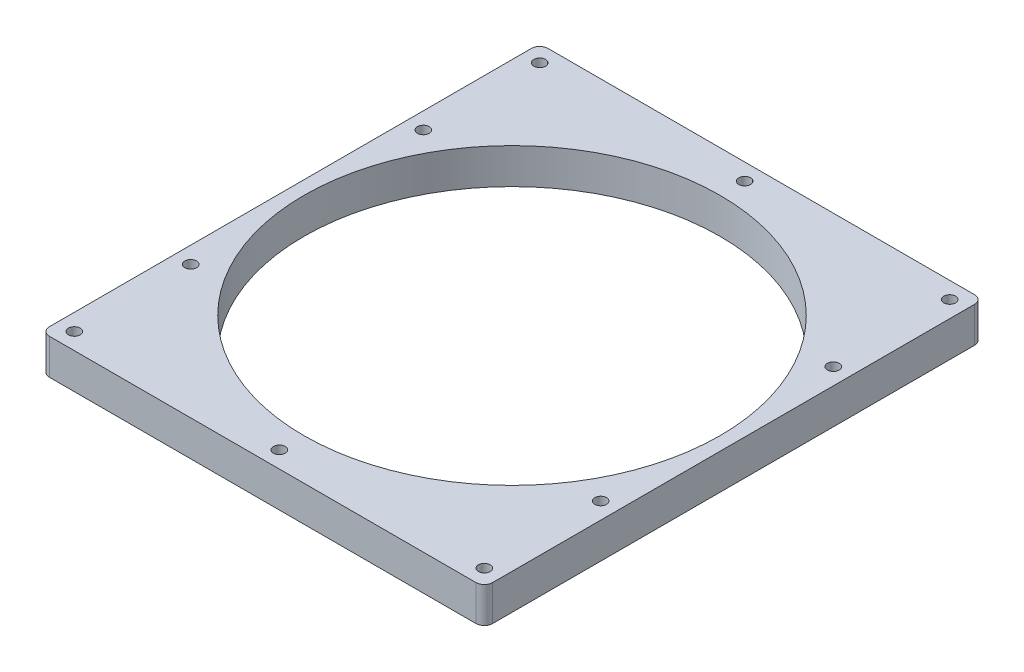
ISO-10303-21;
HEADER;
FILE_DESCRIPTION(('STEP AP214'),'2;1');
FILE_NAME('part.step','',(''),(''),'','','');
FILE_SCHEMA(('AUTOMOTIVE_DESIGN { 1 0 10303 214 1 1 1 1 }'));
ENDSEC;
DATA;
#1=APPLICATION_CONTEXT('core data for automotive mechanical design processes');
#2=APPLICATION_PROTOCOL_DEFINITION('international standard','automotive_design',2000,#1);
#3=PRODUCT_CONTEXT('',#1,'mechanical');
#4=PRODUCT('Part','Part','',(#3));
#5=PRODUCT_RELATED_PRODUCT_CATEGORY('part','',(#4));
#6=PRODUCT_DEFINITION_FORMATION('','',#4);
#7=PRODUCT_DEFINITION_CONTEXT('part definition',#1,'design');
#8=PRODUCT_DEFINITION('design','',#6,#7);
#9=PRODUCT_DEFINITION_SHAPE('','',#8);
#10=(LENGTH_UNIT() NAMED_UNIT(*) SI_UNIT(.MILLI.,.METRE.));
#11=(NAMED_UNIT(*) PLANE_ANGLE_UNIT() SI_UNIT($,.RADIAN.));
#12=(NAMED_UNIT(*) SI_UNIT($,.STERADIAN.) SOLID_ANGLE_UNIT());
#13=UNCERTAINTY_MEASURE_WITH_UNIT(LENGTH_MEASURE(1.E-05),#10,'distance_accuracy_value','');
#14=(GEOMETRIC_REPRESENTATION_CONTEXT(3) GLOBAL_UNCERTAINTY_ASSIGNED_CONTEXT((#13)) GLOBAL_UNIT_ASSIGNED_CONTEXT((#10,
#11,#12)) REPRESENTATION_CONTEXT('',''));
#15=CARTESIAN_POINT('',(0.,0.,0.));
#16=DIRECTION('',(0.,0.,1.));
#17=DIRECTION('',(1.,0.,0.));
#18=AXIS2_PLACEMENT_3D('',#15,#16,#17);
#19=CARTESIAN_POINT('',(0.,12.825,0.));
#20=DIRECTION('',(0.,-1.,0.));
#21=DIRECTION('',(0.,0.,-1.));
#22=AXIS2_PLACEMENT_3D('',#19,#20,#21);
#23=PLANE('',#22);
#24=DIRECTION('',(-1.,0.,0.));
#25=VECTOR('',#24,1.);
#26=CARTESIAN_POINT('',(-80.,12.825,-90.));
#27=LINE('',#26,#25);
#28=CARTESIAN_POINT('',(77.,12.825,-90.));
#29=VERTEX_POINT('',#28);
#30=CARTESIAN_POINT('',(-77.,12.825,-90.));
#31=VERTEX_POINT('',#30);
#32=EDGE_CURVE('E201',#29,#31,#27,.T.);
#33=ORIENTED_EDGE('',*,*,#32,.T.);
#34=CARTESIAN_POINT('',(-77.,12.825,-87.));
#35=DIRECTION('',(0.,-1.,0.));
#36=DIRECTION('',(0.,0.,-1.));
#37=AXIS2_PLACEMENT_3D('',#34,#35,#36);
#38=CIRCLE('',#37,3.);
#39=CARTESIAN_POINT('',(-80.,12.825,-86.9999999999999));
#40=VERTEX_POINT('',#39);
#41=EDGE_CURVE('E174',#31,#40,#38,.F.);
#42=ORIENTED_EDGE('',*,*,#41,.T.);
#43=DIRECTION('',(0.,0.,1.));
#44=VECTOR('',#43,1.);
#45=CARTESIAN_POINT('',(-80.,12.825,90.));
#46=LINE('',#45,#44);
#47=CARTESIAN_POINT('',(-80.,12.825,87.));
#48=VERTEX_POINT('',#47);
#49=EDGE_CURVE('E131',#40,#48,#46,.T.);
#50=ORIENTED_EDGE('',*,*,#49,.T.);
#51=CARTESIAN_POINT('',(-77.,12.825,87.));
#52=DIRECTION('',(0.,-1.,0.));
#53=DIRECTION('',(0.,0.,-1.));
#54=AXIS2_PLACEMENT_3D('',#51,#52,#53);
#55=CIRCLE('',#54,3.);
#56=CARTESIAN_POINT('',(-77.,12.825,90.));
#57=VERTEX_POINT('',#56);
#58=EDGE_CURVE('E66',#48,#57,#55,.F.);
#59=ORIENTED_EDGE('',*,*,#58,.T.);
#60=DIRECTION('',(1.,0.,0.));
#61=VECTOR('',#60,1.);
#62=CARTESIAN_POINT('',(-80.,12.825,90.));
#63=LINE('',#62,#61);
#64=CARTESIAN_POINT('',(77.,12.825,90.));
#65=VERTEX_POINT('',#64);
#66=EDGE_CURVE('E152',#57,#65,#63,.T.);
#67=ORIENTED_EDGE('',*,*,#66,.T.);
#68=CARTESIAN_POINT('',(77.,12.825,87.));
#69=DIRECTION('',(0.,-1.,0.));
#70=DIRECTION('',(0.,0.,-1.));
#71=AXIS2_PLACEMENT_3D('',#68,#69,#70);
#72=CIRCLE('',#71,3.);
#73=CARTESIAN_POINT('',(80.,12.825,87.));
#74=VERTEX_POINT('',#73);
#75=EDGE_CURVE('E171',#65,#74,#72,.F.);
#76=ORIENTED_EDGE('',*,*,#75,.T.);
#77=DIRECTION('',(0.,0.,-1.));
#78=VECTOR('',#77,1.);
#79=CARTESIAN_POINT('',(80.,12.825,90.));
#80=LINE('',#79,#78);
#81=CARTESIAN_POINT('',(80.,12.825,-86.9999999999999));
#82=VERTEX_POINT('',#81);
#83=EDGE_CURVE('E145',#74,#82,#80,.T.);
#84=ORIENTED_EDGE('',*,*,#83,.T.);
#85=CARTESIAN_POINT('',(77.,12.825,-87.));
#86=DIRECTION('',(0.,-1.,0.));
#87=DIRECTION('',(0.,0.,-1.));
#88=AXIS2_PLACEMENT_3D('',#85,#86,#87);
#89=CIRCLE('',#88,3.);
#90=EDGE_CURVE('E168',#82,#29,#89,.F.);
#91=ORIENTED_EDGE('',*,*,#90,.T.);
#92=EDGE_LOOP('',(#33,#42,#50,#59,#67,#76,#84,#91));
#93=FACE_BOUND('',#92,.T.);
#94=CARTESIAN_POINT('',(0.,12.825,0.));
#95=DIRECTION('',(0.,1.,0.));
#96=DIRECTION('',(0.,0.,1.));
#97=AXIS2_PLACEMENT_3D('',#94,#95,#96);
#98=CIRCLE('',#97,75.125);
#99=CARTESIAN_POINT('',(0.,12.825,75.125));
#100=VERTEX_POINT('',#99);
#101=EDGE_CURVE('E214',#100,#100,#98,.T.);
#102=ORIENTED_EDGE('',*,*,#101,.F.);
#103=EDGE_LOOP('',(#102));
#104=FACE_BOUND('',#103,.T.);
#105=CARTESIAN_POINT('',(74.,12.825,-42.));
#106=DIRECTION('',(0.,1.,0.));
#107=DIRECTION('',(0.,0.,1.));
#108=AXIS2_PLACEMENT_3D('',#105,#106,#107);
#109=CIRCLE('',#108,2.125);
#110=CARTESIAN_POINT('',(74.,12.825,-39.875));
#111=VERTEX_POINT('',#110);
#112=EDGE_CURVE('E221',#111,#111,#109,.T.);
#113=ORIENTED_EDGE('',*,*,#112,.F.);
#114=EDGE_LOOP('',(#113));
#115=FACE_BOUND('',#114,.T.);
#116=CARTESIAN_POINT('',(-74.,12.825,84.));
#117=DIRECTION('',(0.,1.,0.));
#118=DIRECTION('',(0.,0.,1.));
#119=AXIS2_PLACEMENT_3D('',#116,#117,#118);
#120=CIRCLE('',#119,2.125);
#121=CARTESIAN_POINT('',(-74.,12.825,86.125));
#122=VERTEX_POINT('',#121);
#123=EDGE_CURVE('E227',#122,#122,#120,.T.);
#124=ORIENTED_EDGE('',*,*,#123,.F.);
#125=EDGE_LOOP('',(#124));
#126=FACE_BOUND('',#125,.T.);
#127=CARTESIAN_POINT('',(-74.,12.825,-42.));
#128=DIRECTION('',(0.,1.,0.));
#129=DIRECTION('',(0.,0.,-1.));
#130=AXIS2_PLACEMENT_3D('',#127,#128,#129);
#131=CIRCLE('',#130,2.125);
#132=CARTESIAN_POINT('',(-74.,12.825,-44.125));
#133=VERTEX_POINT('',#132);
#134=EDGE_CURVE('E235',#133,#133,#131,.T.);
#135=ORIENTED_EDGE('',*,*,#134,.F.);
#136=EDGE_LOOP('',(#135));
#137=FACE_BOUND('',#136,.T.);
#138=CARTESIAN_POINT('',(-74.,12.825,42.));
#139=DIRECTION('',(0.,1.,0.));
#140=DIRECTION('',(0.,0.,1.));
#141=AXIS2_PLACEMENT_3D('',#138,#139,#140);
#142=CIRCLE('',#141,2.125);
#143=CARTESIAN_POINT('',(-74.,12.825,44.125));
#144=VERTEX_POINT('',#143);
#145=EDGE_CURVE('E243',#144,#144,#142,.T.);
#146=ORIENTED_EDGE('',*,*,#145,.F.);
#147=EDGE_LOOP('',(#146));
#148=FACE_BOUND('',#147,.T.);
#149=CARTESIAN_POINT('',(-74.,12.825,-84.));
#150=DIRECTION('',(0.,1.,0.));
#151=DIRECTION('',(0.,0.,-1.));
#152=AXIS2_PLACEMENT_3D('',#149,#150,#151);
#153=CIRCLE('',#152,2.125);
#154=CARTESIAN_POINT('',(-74.,12.825,-86.125));
#155=VERTEX_POINT('',#154);
#156=EDGE_CURVE('E251',#155,#155,#153,.T.);
#157=ORIENTED_EDGE('',*,*,#156,.F.);
#158=EDGE_LOOP('',(#157));
#159=FACE_BOUND('',#158,.T.);
#160=CARTESIAN_POINT('',(74.,12.825,84.));
#161=DIRECTION('',(0.,1.,0.));
#162=DIRECTION('',(0.,0.,-1.));
#163=AXIS2_PLACEMENT_3D('',#160,#161,#162);
#164=CIRCLE('',#163,2.125);
#165=CARTESIAN_POINT('',(74.,12.825,81.875));
#166=VERTEX_POINT('',#165);
#167=EDGE_CURVE('E259',#166,#166,#164,.T.);
#168=ORIENTED_EDGE('',*,*,#167,.F.);
#169=EDGE_LOOP('',(#168));
#170=FACE_BOUND('',#169,.T.);
#171=CARTESIAN_POINT('',(74.,12.825,42.));
#172=DIRECTION('',(0.,1.,0.));
#173=DIRECTION('',(0.,0.,-1.));
#174=AXIS2_PLACEMENT_3D('',#171,#172,#173);
#175=CIRCLE('',#174,2.125);
#176=CARTESIAN_POINT('',(74.,12.825,39.875));
#177=VERTEX_POINT('',#176);
#178=EDGE_CURVE('E267',#177,#177,#175,.T.);
#179=ORIENTED_EDGE('',*,*,#178,.F.);
#180=EDGE_LOOP('',(#179));
#181=FACE_BOUND('',#180,.T.);
#182=CARTESIAN_POINT('',(74.,12.825,-84.));
#183=DIRECTION('',(0.,1.,0.));
#184=DIRECTION('',(0.,0.,1.));
#185=AXIS2_PLACEMENT_3D('',#182,#183,#184);
#186=CIRCLE('',#185,2.125);
#187=CARTESIAN_POINT('',(74.,12.825,-81.875));
#188=VERTEX_POINT('',#187);
#189=EDGE_CURVE('E275',#188,#188,#186,.T.);
#190=ORIENTED_EDGE('',*,*,#189,.F.);
#191=EDGE_LOOP('',(#190));
#192=FACE_BOUND('',#191,.T.);
#193=CARTESIAN_POINT('',(0.,12.825,84.));
#194=DIRECTION('',(0.,1.,0.));
#195=DIRECTION('',(0.,0.,1.));
#196=AXIS2_PLACEMENT_3D('',#193,#194,#195);
#197=CIRCLE('',#196,2.125);
#198=CARTESIAN_POINT('',(0.,12.825,86.125));
#199=VERTEX_POINT('',#198);
#200=EDGE_CURVE('E283',#199,#199,#197,.T.);
#201=ORIENTED_EDGE('',*,*,#200,.F.);
#202=EDGE_LOOP('',(#201));
#203=FACE_BOUND('',#202,.T.);
#204=CARTESIAN_POINT('',(0.,12.825,-84.));
#205=DIRECTION('',(0.,1.,0.));
#206=DIRECTION('',(0.,0.,-1.));
#207=AXIS2_PLACEMENT_3D('',#204,#205,#206);
#208=CIRCLE('',#207,2.125);
#209=CARTESIAN_POINT('',(0.,12.825,-86.125));
#210=VERTEX_POINT('',#209);
#211=EDGE_CURVE('E291',#210,#210,#208,.T.);
#212=ORIENTED_EDGE('',*,*,#211,.F.);
#213=EDGE_LOOP('',(#212));
#214=FACE_BOUND('',#213,.T.);
#215=ADVANCED_FACE('F45',(#93,#104,#115,#126,#137,#148,#159,#170,#181,#192,#203,#214),#23,.F.);
#216=CARTESIAN_POINT('',(0.,0.,0.));
#217=DIRECTION('',(0.,-1.,0.));
#218=DIRECTION('',(0.,0.,-1.));
#219=AXIS2_PLACEMENT_3D('',#216,#217,#218);
#220=PLANE('',#219);
#221=CARTESIAN_POINT('',(0.,0.,84.));
#222=DIRECTION('',(0.,1.,0.));
#223=DIRECTION('',(0.,0.,1.));
#224=AXIS2_PLACEMENT_3D('',#221,#222,#223);
#225=CIRCLE('',#224,2.125);
#226=CARTESIAN_POINT('',(0.,0.,86.125));
#227=VERTEX_POINT('',#226);
#228=EDGE_CURVE('E287',#227,#227,#225,.T.);
#229=ORIENTED_EDGE('',*,*,#228,.T.);
#230=EDGE_LOOP('',(#229));
#231=FACE_BOUND('',#230,.T.);
#232=CARTESIAN_POINT('',(74.,0.,42.));
#233=DIRECTION('',(0.,1.,0.));
#234=DIRECTION('',(0.,0.,-1.));
#235=AXIS2_PLACEMENT_3D('',#232,#233,#234);
#236=CIRCLE('',#235,2.125);
#237=CARTESIAN_POINT('',(74.,0.,39.875));
#238=VERTEX_POINT('',#237);
#239=EDGE_CURVE('E271',#238,#238,#236,.T.);
#240=ORIENTED_EDGE('',*,*,#239,.T.);
#241=EDGE_LOOP('',(#240));
#242=FACE_BOUND('',#241,.T.);
#243=CARTESIAN_POINT('',(-74.,0.,-84.));
#244=DIRECTION('',(0.,1.,0.));
#245=DIRECTION('',(0.,0.,-1.));
#246=AXIS2_PLACEMENT_3D('',#243,#244,#245);
#247=CIRCLE('',#246,2.125);
#248=CARTESIAN_POINT('',(-74.,0.,-86.125));
#249=VERTEX_POINT('',#248);
#250=EDGE_CURVE('E255',#249,#249,#247,.T.);
#251=ORIENTED_EDGE('',*,*,#250,.T.);
#252=EDGE_LOOP('',(#251));
#253=FACE_BOUND('',#252,.T.);
#254=CARTESIAN_POINT('',(-74.,0.,-42.));
#255=DIRECTION('',(0.,1.,0.));
#256=DIRECTION('',(0.,0.,-1.));
#257=AXIS2_PLACEMENT_3D('',#254,#255,#256);
#258=CIRCLE('',#257,2.125);
#259=CARTESIAN_POINT('',(-74.,0.,-44.125));
#260=VERTEX_POINT('',#259);
#261=EDGE_CURVE('E239',#260,#260,#258,.T.);
#262=ORIENTED_EDGE('',*,*,#261,.T.);
#263=EDGE_LOOP('',(#262));
#264=FACE_BOUND('',#263,.T.);
#265=CARTESIAN_POINT('',(74.,0.,-42.));
#266=DIRECTION('',(0.,1.,0.));
#267=DIRECTION('',(0.,0.,1.));
#268=AXIS2_PLACEMENT_3D('',#265,#266,#267);
#269=CIRCLE('',#268,2.125);
#270=CARTESIAN_POINT('',(74.,0.,-39.875));
#271=VERTEX_POINT('',#270);
#272=EDGE_CURVE('E223',#271,#271,#269,.T.);
#273=ORIENTED_EDGE('',*,*,#272,.T.);
#274=EDGE_LOOP('',(#273));
#275=FACE_BOUND('',#274,.T.);
#276=DIRECTION('',(0.,0.,1.));
#277=VECTOR('',#276,1.);
#278=CARTESIAN_POINT('',(-80.,0.,90.));
#279=LINE('',#278,#277);
#280=CARTESIAN_POINT('',(-80.,0.,-86.9999999999999));
#281=VERTEX_POINT('',#280);
#282=CARTESIAN_POINT('',(-80.,0.,87.));
#283=VERTEX_POINT('',#282);
#284=EDGE_CURVE('E129',#281,#283,#279,.T.);
#285=ORIENTED_EDGE('',*,*,#284,.F.);
#286=CARTESIAN_POINT('',(-77.,0.,-87.));
#287=DIRECTION('',(0.,-1.,0.));
#288=DIRECTION('',(0.,0.,-1.));
#289=AXIS2_PLACEMENT_3D('',#286,#287,#288);
#290=CIRCLE('',#289,3.);
#291=CARTESIAN_POINT('',(-77.,0.,-90.));
#292=VERTEX_POINT('',#291);
#293=EDGE_CURVE('E111',#281,#292,#290,.T.);
#294=ORIENTED_EDGE('',*,*,#293,.T.);
#295=DIRECTION('',(-1.,0.,0.));
#296=VECTOR('',#295,1.);
#297=CARTESIAN_POINT('',(-80.,0.,-90.));
#298=LINE('',#297,#296);
#299=CARTESIAN_POINT('',(77.,0.,-90.));
#300=VERTEX_POINT('',#299);
#301=EDGE_CURVE('E141',#300,#292,#298,.T.);
#302=ORIENTED_EDGE('',*,*,#301,.F.);
#303=CARTESIAN_POINT('',(77.,0.,-87.));
#304=DIRECTION('',(0.,-1.,0.));
#305=DIRECTION('',(0.,0.,-1.));
#306=AXIS2_PLACEMENT_3D('',#303,#304,#305);
#307=CIRCLE('',#306,3.);
#308=CARTESIAN_POINT('',(80.,0.,-86.9999999999999));
#309=VERTEX_POINT('',#308);
#310=EDGE_CURVE('E156',#300,#309,#307,.T.);
#311=ORIENTED_EDGE('',*,*,#310,.T.);
#312=DIRECTION('',(0.,0.,-1.));
#313=VECTOR('',#312,1.);
#314=CARTESIAN_POINT('',(80.,0.,90.));
#315=LINE('',#314,#313);
#316=CARTESIAN_POINT('',(80.,0.,87.));
#317=VERTEX_POINT('',#316);
#318=EDGE_CURVE('E147',#317,#309,#315,.T.);
#319=ORIENTED_EDGE('',*,*,#318,.F.);
#320=CARTESIAN_POINT('',(77.,0.,87.));
#321=DIRECTION('',(0.,-1.,0.));
#322=DIRECTION('',(0.,0.,-1.));
#323=AXIS2_PLACEMENT_3D('',#320,#321,#322);
#324=CIRCLE('',#323,3.);
#325=CARTESIAN_POINT('',(77.,0.,90.));
#326=VERTEX_POINT('',#325);
#327=EDGE_CURVE('E123',#317,#326,#324,.T.);
#328=ORIENTED_EDGE('',*,*,#327,.T.);
#329=DIRECTION('',(1.,0.,0.));
#330=VECTOR('',#329,1.);
#331=CARTESIAN_POINT('',(-80.,0.,90.));
#332=LINE('',#331,#330);
#333=CARTESIAN_POINT('',(-77.,0.,90.));
#334=VERTEX_POINT('',#333);
#335=EDGE_CURVE('E140',#334,#326,#332,.T.);
#336=ORIENTED_EDGE('',*,*,#335,.F.);
#337=CARTESIAN_POINT('',(-77.,0.,87.));
#338=DIRECTION('',(0.,-1.,0.));
#339=DIRECTION('',(0.,0.,-1.));
#340=AXIS2_PLACEMENT_3D('',#337,#338,#339);
#341=CIRCLE('',#340,3.);
#342=EDGE_CURVE('E133',#334,#283,#341,.T.);
#343=ORIENTED_EDGE('',*,*,#342,.T.);
#344=EDGE_LOOP('',(#285,#294,#302,#311,#319,#328,#336,#343));
#345=FACE_BOUND('',#344,.T.);
#346=CARTESIAN_POINT('',(0.,0.,0.));
#347=DIRECTION('',(0.,1.,0.));
#348=DIRECTION('',(0.,0.,1.));
#349=AXIS2_PLACEMENT_3D('',#346,#347,#348);
#350=CIRCLE('',#349,75.125);
#351=CARTESIAN_POINT('',(0.,0.,75.125));
#352=VERTEX_POINT('',#351);
#353=EDGE_CURVE('E207',#352,#352,#350,.T.);
#354=ORIENTED_EDGE('',*,*,#353,.T.);
#355=EDGE_LOOP('',(#354));
#356=FACE_BOUND('',#355,.T.);
#357=CARTESIAN_POINT('',(-74.,0.,84.));
#358=DIRECTION('',(0.,1.,0.));
#359=DIRECTION('',(0.,0.,1.));
#360=AXIS2_PLACEMENT_3D('',#357,#358,#359);
#361=CIRCLE('',#360,2.125);
#362=CARTESIAN_POINT('',(-74.,0.,86.125));
#363=VERTEX_POINT('',#362);
#364=EDGE_CURVE('E231',#363,#363,#361,.T.);
#365=ORIENTED_EDGE('',*,*,#364,.T.);
#366=EDGE_LOOP('',(#365));
#367=FACE_BOUND('',#366,.T.);
#368=CARTESIAN_POINT('',(-74.,0.,42.));
#369=DIRECTION('',(0.,1.,0.));
#370=DIRECTION('',(0.,0.,1.));
#371=AXIS2_PLACEMENT_3D('',#368,#369,#370);
#372=CIRCLE('',#371,2.125);
#373=CARTESIAN_POINT('',(-74.,0.,44.125));
#374=VERTEX_POINT('',#373);
#375=EDGE_CURVE('E247',#374,#374,#372,.T.);
#376=ORIENTED_EDGE('',*,*,#375,.T.);
#377=EDGE_LOOP('',(#376));
#378=FACE_BOUND('',#377,.T.);
#379=CARTESIAN_POINT('',(74.,0.,84.));
#380=DIRECTION('',(0.,1.,0.));
#381=DIRECTION('',(0.,0.,-1.));
#382=AXIS2_PLACEMENT_3D('',#379,#380,#381);
#383=CIRCLE('',#382,2.125);
#384=CARTESIAN_POINT('',(74.,0.,81.875));
#385=VERTEX_POINT('',#384);
#386=EDGE_CURVE('E263',#385,#385,#383,.T.);
#387=ORIENTED_EDGE('',*,*,#386,.T.);
#388=EDGE_LOOP('',(#387));
#389=FACE_BOUND('',#388,.T.);
#390=CARTESIAN_POINT('',(74.,0.,-84.));
#391=DIRECTION('',(0.,1.,0.));
#392=DIRECTION('',(0.,0.,1.));
#393=AXIS2_PLACEMENT_3D('',#390,#391,#392);
#394=CIRCLE('',#393,2.125);
#395=CARTESIAN_POINT('',(74.,0.,-81.875));
#396=VERTEX_POINT('',#395);
#397=EDGE_CURVE('E279',#396,#396,#394,.T.);
#398=ORIENTED_EDGE('',*,*,#397,.T.);
#399=EDGE_LOOP('',(#398));
#400=FACE_BOUND('',#399,.T.);
#401=CARTESIAN_POINT('',(0.,0.,-84.));
#402=DIRECTION('',(0.,1.,0.));
#403=DIRECTION('',(0.,0.,-1.));
#404=AXIS2_PLACEMENT_3D('',#401,#402,#403);
#405=CIRCLE('',#404,2.125);
#406=CARTESIAN_POINT('',(0.,0.,-86.125));
#407=VERTEX_POINT('',#406);
#408=EDGE_CURVE('E295',#407,#407,#405,.T.);
#409=ORIENTED_EDGE('',*,*,#408,.T.);
#410=EDGE_LOOP('',(#409));
#411=FACE_BOUND('',#410,.T.);
#412=ADVANCED_FACE('F136',(#231,#242,#253,#264,#275,#345,#356,#367,#378,#389,#400,#411),#220,.T.);
#413=CARTESIAN_POINT('',(80.,12.825,90.));
#414=DIRECTION('',(-1.,0.,0.));
#415=DIRECTION('',(0.,0.,1.));
#416=AXIS2_PLACEMENT_3D('',#413,#414,#415);
#417=PLANE('',#416);
#418=ORIENTED_EDGE('',*,*,#83,.F.);
#419=DIRECTION('',(0.,-1.,0.));
#420=VECTOR('',#419,1.);
#421=CARTESIAN_POINT('',(80.,12.825,87.));
#422=LINE('',#421,#420);
#423=EDGE_CURVE('E180',#74,#317,#422,.T.);
#424=ORIENTED_EDGE('',*,*,#423,.T.);
#425=ORIENTED_EDGE('',*,*,#318,.T.);
#426=DIRECTION('',(0.,-1.,0.));
#427=VECTOR('',#426,1.);
#428=CARTESIAN_POINT('',(80.,12.825,-87.));
#429=LINE('',#428,#427);
#430=EDGE_CURVE('E177',#309,#82,#429,.F.);
#431=ORIENTED_EDGE('',*,*,#430,.T.);
#432=EDGE_LOOP('',(#418,#424,#425,#431));
#433=FACE_BOUND('',#432,.T.);
#434=ADVANCED_FACE('F196',(#433),#417,.F.);
#435=CARTESIAN_POINT('',(-80.,12.825,-90.));
#436=DIRECTION('',(0.,0.,1.));
#437=DIRECTION('',(1.,0.,0.));
#438=AXIS2_PLACEMENT_3D('',#435,#436,#437);
#439=PLANE('',#438);
#440=ORIENTED_EDGE('',*,*,#301,.T.);
#441=DIRECTION('',(0.,-1.,0.));
#442=VECTOR('',#441,1.);
#443=CARTESIAN_POINT('',(-77.,12.825,-90.));
#444=LINE('',#443,#442);
#445=EDGE_CURVE('E116',#292,#31,#444,.F.);
#446=ORIENTED_EDGE('',*,*,#445,.T.);
#447=ORIENTED_EDGE('',*,*,#32,.F.);
#448=DIRECTION('',(0.,-1.,0.));
#449=VECTOR('',#448,1.);
#450=CARTESIAN_POINT('',(77.,12.825,-90.));
#451=LINE('',#450,#449);
#452=EDGE_CURVE('E122',#29,#300,#451,.T.);
#453=ORIENTED_EDGE('',*,*,#452,.T.);
#454=EDGE_LOOP('',(#440,#446,#447,#453));
#455=FACE_BOUND('',#454,.T.);
#456=ADVANCED_FACE('F323',(#455),#439,.F.);
#457=CARTESIAN_POINT('',(-80.,12.825,90.));
#458=DIRECTION('',(1.,0.,0.));
#459=DIRECTION('',(0.,0.,-1.));
#460=AXIS2_PLACEMENT_3D('',#457,#458,#459);
#461=PLANE('',#460);
#462=ORIENTED_EDGE('',*,*,#49,.F.);
#463=DIRECTION('',(0.,-1.,0.));
#464=VECTOR('',#463,1.);
#465=CARTESIAN_POINT('',(-80.,12.825,-87.));
#466=LINE('',#465,#464);
#467=EDGE_CURVE('E115',#40,#281,#466,.T.);
#468=ORIENTED_EDGE('',*,*,#467,.T.);
#469=ORIENTED_EDGE('',*,*,#284,.T.);
#470=DIRECTION('',(0.,-1.,0.));
#471=VECTOR('',#470,1.);
#472=CARTESIAN_POINT('',(-80.,12.825,87.));
#473=LINE('',#472,#471);
#474=EDGE_CURVE('E134',#283,#48,#473,.F.);
#475=ORIENTED_EDGE('',*,*,#474,.T.);
#476=EDGE_LOOP('',(#462,#468,#469,#475));
#477=FACE_BOUND('',#476,.T.);
#478=ADVANCED_FACE('F128',(#477),#461,.F.);
#479=CARTESIAN_POINT('',(-80.,12.825,90.));
#480=DIRECTION('',(0.,0.,-1.));
#481=DIRECTION('',(-1.,0.,0.));
#482=AXIS2_PLACEMENT_3D('',#479,#480,#481);
#483=PLANE('',#482);
#484=ORIENTED_EDGE('',*,*,#335,.T.);
#485=DIRECTION('',(0.,-1.,0.));
#486=VECTOR('',#485,1.);
#487=CARTESIAN_POINT('',(77.,12.825,90.));
#488=LINE('',#487,#486);
#489=EDGE_CURVE('E11',#326,#65,#488,.F.);
#490=ORIENTED_EDGE('',*,*,#489,.T.);
#491=ORIENTED_EDGE('',*,*,#66,.F.);
#492=DIRECTION('',(0.,-1.,0.));
#493=VECTOR('',#492,1.);
#494=CARTESIAN_POINT('',(-77.,12.825,90.));
#495=LINE('',#494,#493);
#496=EDGE_CURVE('E54',#57,#334,#495,.T.);
#497=ORIENTED_EDGE('',*,*,#496,.T.);
#498=EDGE_LOOP('',(#484,#490,#491,#497));
#499=FACE_BOUND('',#498,.T.);
#500=ADVANCED_FACE('F186',(#499),#483,.F.);
#501=CARTESIAN_POINT('',(0.,12.825,0.));
#502=DIRECTION('',(0.,-1.,0.));
#503=DIRECTION('',(0.,0.,-1.));
#504=AXIS2_PLACEMENT_3D('',#501,#502,#503);
#505=CYLINDRICAL_SURFACE('',#504,75.125);
#506=ORIENTED_EDGE('',*,*,#101,.T.);
#507=EDGE_LOOP('',(#506));
#508=FACE_BOUND('',#507,.T.);
#509=ORIENTED_EDGE('',*,*,#353,.F.);
#510=EDGE_LOOP('',(#509));
#511=FACE_BOUND('',#510,.T.);
#512=ADVANCED_FACE('F316',(#508,#511),#505,.F.);
#513=CARTESIAN_POINT('',(74.,12.825,-42.));
#514=DIRECTION('',(0.,-1.,0.));
#515=DIRECTION('',(0.,0.,-1.));
#516=AXIS2_PLACEMENT_3D('',#513,#514,#515);
#517=CYLINDRICAL_SURFACE('',#516,2.125);
#518=ORIENTED_EDGE('',*,*,#112,.T.);
#519=EDGE_LOOP('',(#518));
#520=FACE_BOUND('',#519,.T.);
#521=ORIENTED_EDGE('',*,*,#272,.F.);
#522=EDGE_LOOP('',(#521));
#523=FACE_BOUND('',#522,.T.);
#524=ADVANCED_FACE('F446',(#520,#523),#517,.F.);
#525=CARTESIAN_POINT('',(-74.,12.825,84.));
#526=DIRECTION('',(0.,-1.,0.));
#527=DIRECTION('',(0.,0.,-1.));
#528=AXIS2_PLACEMENT_3D('',#525,#526,#527);
#529=CYLINDRICAL_SURFACE('',#528,2.125);
#530=ORIENTED_EDGE('',*,*,#123,.T.);
#531=EDGE_LOOP('',(#530));
#532=FACE_BOUND('',#531,.T.);
#533=ORIENTED_EDGE('',*,*,#364,.F.);
#534=EDGE_LOOP('',(#533));
#535=FACE_BOUND('',#534,.T.);
#536=ADVANCED_FACE('F436',(#532,#535),#529,.F.);
#537=CARTESIAN_POINT('',(-74.,12.825,-42.));
#538=DIRECTION('',(0.,-1.,0.));
#539=DIRECTION('',(0.,0.,-1.));
#540=AXIS2_PLACEMENT_3D('',#537,#538,#539);
#541=CYLINDRICAL_SURFACE('',#540,2.125);
#542=ORIENTED_EDGE('',*,*,#134,.T.);
#543=EDGE_LOOP('',(#542));
#544=FACE_BOUND('',#543,.T.);
#545=ORIENTED_EDGE('',*,*,#261,.F.);
#546=EDGE_LOOP('',(#545));
#547=FACE_BOUND('',#546,.T.);
#548=ADVANCED_FACE('F426',(#544,#547),#541,.F.);
#549=CARTESIAN_POINT('',(-74.,12.825,42.));
#550=DIRECTION('',(0.,-1.,0.));
#551=DIRECTION('',(0.,0.,-1.));
#552=AXIS2_PLACEMENT_3D('',#549,#550,#551);
#553=CYLINDRICAL_SURFACE('',#552,2.125);
#554=ORIENTED_EDGE('',*,*,#145,.T.);
#555=EDGE_LOOP('',(#554));
#556=FACE_BOUND('',#555,.T.);
#557=ORIENTED_EDGE('',*,*,#375,.F.);
#558=EDGE_LOOP('',(#557));
#559=FACE_BOUND('',#558,.T.);
#560=ADVANCED_FACE('F416',(#556,#559),#553,.F.);
#561=CARTESIAN_POINT('',(-74.,12.825,-84.));
#562=DIRECTION('',(0.,-1.,0.));
#563=DIRECTION('',(0.,0.,-1.));
#564=AXIS2_PLACEMENT_3D('',#561,#562,#563);
#565=CYLINDRICAL_SURFACE('',#564,2.125);
#566=ORIENTED_EDGE('',*,*,#156,.T.);
#567=EDGE_LOOP('',(#566));
#568=FACE_BOUND('',#567,.T.);
#569=ORIENTED_EDGE('',*,*,#250,.F.);
#570=EDGE_LOOP('',(#569));
#571=FACE_BOUND('',#570,.T.);
#572=ADVANCED_FACE('F406',(#568,#571),#565,.F.);
#573=CARTESIAN_POINT('',(74.,12.825,84.));
#574=DIRECTION('',(0.,-1.,0.));
#575=DIRECTION('',(0.,0.,-1.));
#576=AXIS2_PLACEMENT_3D('',#573,#574,#575);
#577=CYLINDRICAL_SURFACE('',#576,2.125);
#578=ORIENTED_EDGE('',*,*,#167,.T.);
#579=EDGE_LOOP('',(#578));
#580=FACE_BOUND('',#579,.T.);
#581=ORIENTED_EDGE('',*,*,#386,.F.);
#582=EDGE_LOOP('',(#581));
#583=FACE_BOUND('',#582,.T.);
#584=ADVANCED_FACE('F396',(#580,#583),#577,.F.);
#585=CARTESIAN_POINT('',(74.,12.825,42.));
#586=DIRECTION('',(0.,-1.,0.));
#587=DIRECTION('',(0.,0.,-1.));
#588=AXIS2_PLACEMENT_3D('',#585,#586,#587);
#589=CYLINDRICAL_SURFACE('',#588,2.125);
#590=ORIENTED_EDGE('',*,*,#178,.T.);
#591=EDGE_LOOP('',(#590));
#592=FACE_BOUND('',#591,.T.);
#593=ORIENTED_EDGE('',*,*,#239,.F.);
#594=EDGE_LOOP('',(#593));
#595=FACE_BOUND('',#594,.T.);
#596=ADVANCED_FACE('F386',(#592,#595),#589,.F.);
#597=CARTESIAN_POINT('',(74.,12.825,-84.));
#598=DIRECTION('',(0.,-1.,0.));
#599=DIRECTION('',(0.,0.,-1.));
#600=AXIS2_PLACEMENT_3D('',#597,#598,#599);
#601=CYLINDRICAL_SURFACE('',#600,2.125);
#602=ORIENTED_EDGE('',*,*,#189,.T.);
#603=EDGE_LOOP('',(#602));
#604=FACE_BOUND('',#603,.T.);
#605=ORIENTED_EDGE('',*,*,#397,.F.);
#606=EDGE_LOOP('',(#605));
#607=FACE_BOUND('',#606,.T.);
#608=ADVANCED_FACE('F376',(#604,#607),#601,.F.);
#609=CARTESIAN_POINT('',(0.,12.825,84.));
#610=DIRECTION('',(0.,-1.,0.));
#611=DIRECTION('',(0.,0.,-1.));
#612=AXIS2_PLACEMENT_3D('',#609,#610,#611);
#613=CYLINDRICAL_SURFACE('',#612,2.125);
#614=ORIENTED_EDGE('',*,*,#200,.T.);
#615=EDGE_LOOP('',(#614));
#616=FACE_BOUND('',#615,.T.);
#617=ORIENTED_EDGE('',*,*,#228,.F.);
#618=EDGE_LOOP('',(#617));
#619=FACE_BOUND('',#618,.T.);
#620=ADVANCED_FACE('F367',(#616,#619),#613,.F.);
#621=CARTESIAN_POINT('',(0.,12.825,-84.));
#622=DIRECTION('',(0.,-1.,0.));
#623=DIRECTION('',(0.,0.,-1.));
#624=AXIS2_PLACEMENT_3D('',#621,#622,#623);
#625=CYLINDRICAL_SURFACE('',#624,2.125);
#626=ORIENTED_EDGE('',*,*,#211,.T.);
#627=EDGE_LOOP('',(#626));
#628=FACE_BOUND('',#627,.T.);
#629=ORIENTED_EDGE('',*,*,#408,.F.);
#630=EDGE_LOOP('',(#629));
#631=FACE_BOUND('',#630,.T.);
#632=ADVANCED_FACE('F303',(#628,#631),#625,.F.);
#633=CARTESIAN_POINT('',(-77.,12.825,-87.));
#634=DIRECTION('',(0.,-1.,0.));
#635=DIRECTION('',(0.,0.,-1.));
#636=AXIS2_PLACEMENT_3D('',#633,#634,#635);
#637=CYLINDRICAL_SURFACE('',#636,3.);
#638=ORIENTED_EDGE('',*,*,#41,.F.);
#639=ORIENTED_EDGE('',*,*,#445,.F.);
#640=ORIENTED_EDGE('',*,*,#293,.F.);
#641=ORIENTED_EDGE('',*,*,#467,.F.);
#642=EDGE_LOOP('',(#638,#639,#640,#641));
#643=FACE_BOUND('',#642,.T.);
#644=ADVANCED_FACE('F114',(#643),#637,.T.);
#645=CARTESIAN_POINT('',(77.,12.825,87.));
#646=DIRECTION('',(0.,-1.,0.));
#647=DIRECTION('',(0.,0.,-1.));
#648=AXIS2_PLACEMENT_3D('',#645,#646,#647);
#649=CYLINDRICAL_SURFACE('',#648,3.);
#650=ORIENTED_EDGE('',*,*,#75,.F.);
#651=ORIENTED_EDGE('',*,*,#489,.F.);
#652=ORIENTED_EDGE('',*,*,#327,.F.);
#653=ORIENTED_EDGE('',*,*,#423,.F.);
#654=EDGE_LOOP('',(#650,#651,#652,#653));
#655=FACE_BOUND('',#654,.T.);
#656=ADVANCED_FACE('F193',(#655),#649,.T.);
#657=CARTESIAN_POINT('',(77.,12.825,-87.));
#658=DIRECTION('',(0.,-1.,0.));
#659=DIRECTION('',(0.,0.,-1.));
#660=AXIS2_PLACEMENT_3D('',#657,#658,#659);
#661=CYLINDRICAL_SURFACE('',#660,3.);
#662=ORIENTED_EDGE('',*,*,#90,.F.);
#663=ORIENTED_EDGE('',*,*,#430,.F.);
#664=ORIENTED_EDGE('',*,*,#310,.F.);
#665=ORIENTED_EDGE('',*,*,#452,.F.);
#666=EDGE_LOOP('',(#662,#663,#664,#665));
#667=FACE_BOUND('',#666,.T.);
#668=ADVANCED_FACE('F332',(#667),#661,.T.);
#669=CARTESIAN_POINT('',(-77.,12.825,87.));
#670=DIRECTION('',(0.,-1.,0.));
#671=DIRECTION('',(0.,0.,-1.));
#672=AXIS2_PLACEMENT_3D('',#669,#670,#671);
#673=CYLINDRICAL_SURFACE('',#672,3.);
#674=ORIENTED_EDGE('',*,*,#58,.F.);
#675=ORIENTED_EDGE('',*,*,#474,.F.);
#676=ORIENTED_EDGE('',*,*,#342,.F.);
#677=ORIENTED_EDGE('',*,*,#496,.F.);
#678=EDGE_LOOP('',(#674,#675,#676,#677));
#679=FACE_BOUND('',#678,.T.);
#680=ADVANCED_FACE('F47',(#679),#673,.T.);
#681=CLOSED_SHELL('',(#215,#412,#434,#456,#478,#500,#512,#524,#536,#548,#560,#572,#584,#596,
#608,#620,#632,#644,#656,#668,#680));
#682=MANIFOLD_SOLID_BREP('B2',#681);
#683=ADVANCED_BREP_SHAPE_REPRESENTATION('',(#18,#682),#14);
#684=SHAPE_DEFINITION_REPRESENTATION(#9,#683);
ENDSEC;
END-ISO-10303-21;
